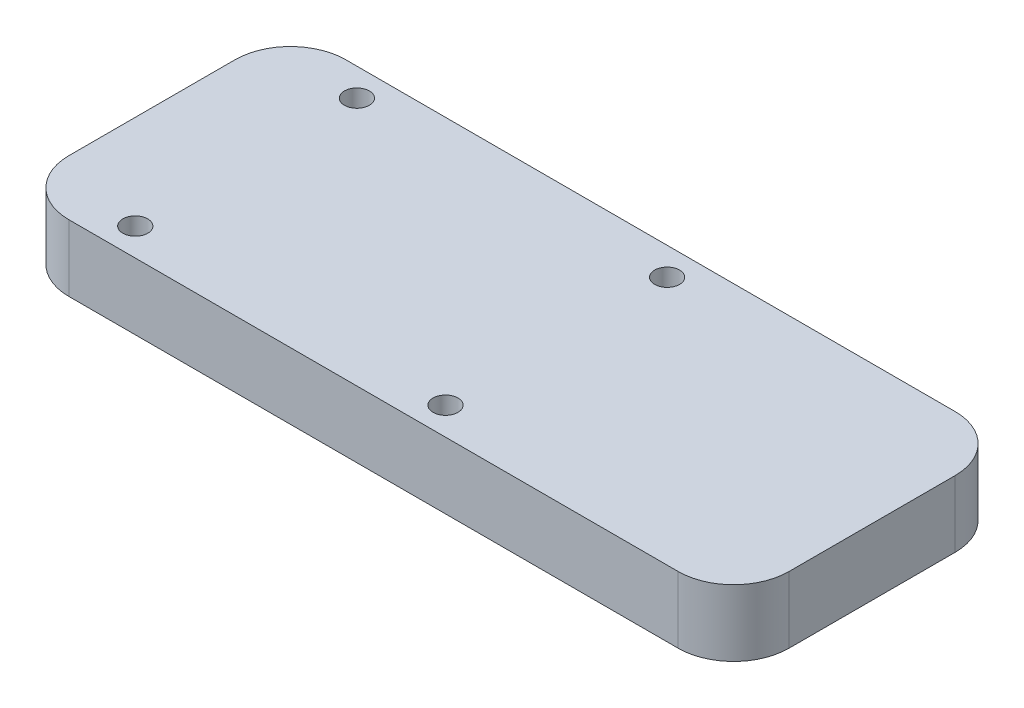
ISO-10303-21;
HEADER;
FILE_DESCRIPTION(('STEP AP214'),'2;1');
FILE_NAME('part.step','',(''),(''),'','','');
FILE_SCHEMA(('AUTOMOTIVE_DESIGN { 1 0 10303 214 1 1 1 1 }'));
ENDSEC;
DATA;
#1=APPLICATION_CONTEXT('core data for automotive mechanical design processes');
#2=APPLICATION_PROTOCOL_DEFINITION('international standard','automotive_design',2000,#1);
#3=PRODUCT_CONTEXT('',#1,'mechanical');
#4=PRODUCT('Part','Part','',(#3));
#5=PRODUCT_RELATED_PRODUCT_CATEGORY('part','',(#4));
#6=PRODUCT_DEFINITION_FORMATION('','',#4);
#7=PRODUCT_DEFINITION_CONTEXT('part definition',#1,'design');
#8=PRODUCT_DEFINITION('design','',#6,#7);
#9=PRODUCT_DEFINITION_SHAPE('','',#8);
#10=(LENGTH_UNIT() NAMED_UNIT(*) SI_UNIT(.MILLI.,.METRE.));
#11=(NAMED_UNIT(*) PLANE_ANGLE_UNIT() SI_UNIT($,.RADIAN.));
#12=(NAMED_UNIT(*) SI_UNIT($,.STERADIAN.) SOLID_ANGLE_UNIT());
#13=UNCERTAINTY_MEASURE_WITH_UNIT(LENGTH_MEASURE(1.E-05),#10,'distance_accuracy_value','');
#14=(GEOMETRIC_REPRESENTATION_CONTEXT(3) GLOBAL_UNCERTAINTY_ASSIGNED_CONTEXT((#13)) GLOBAL_UNIT_ASSIGNED_CONTEXT((#10,
#11,#12)) REPRESENTATION_CONTEXT('',''));
#15=CARTESIAN_POINT('',(0.,0.,0.));
#16=DIRECTION('',(0.,0.,1.));
#17=DIRECTION('',(1.,0.,0.));
#18=AXIS2_PLACEMENT_3D('',#15,#16,#17);
#19=CARTESIAN_POINT('',(-82.5827814569536,12.,-33.2119205298013));
#20=DIRECTION('',(0.,1.,0.));
#21=DIRECTION('',(0.,0.,1.));
#22=AXIS2_PLACEMENT_3D('',#19,#20,#21);
#23=PLANE('',#22);
#24=CARTESIAN_POINT('',(-75.5827814569536,12.,-38.2119205298013));
#25=DIRECTION('',(0.,1.,0.));
#26=DIRECTION('',(0.,0.,1.));
#27=AXIS2_PLACEMENT_3D('',#24,#25,#26);
#28=CIRCLE('',#27,2.25);
#29=CARTESIAN_POINT('',(-75.5827814569536,12.,-35.9619205298013));
#30=VERTEX_POINT('',#29);
#31=EDGE_CURVE('E191',#30,#30,#28,.T.);
#32=ORIENTED_EDGE('',*,*,#31,.F.);
#33=EDGE_LOOP('',(#32));
#34=FACE_BOUND('',#33,.T.);
#35=CARTESIAN_POINT('',(-19.5827814569536,12.,1.78807947019867));
#36=DIRECTION('',(0.,1.,0.));
#37=DIRECTION('',(0.,0.,1.));
#38=AXIS2_PLACEMENT_3D('',#35,#36,#37);
#39=CIRCLE('',#38,2.25);
#40=CARTESIAN_POINT('',(-19.5827814569536,12.,4.03807947019867));
#41=VERTEX_POINT('',#40);
#42=EDGE_CURVE('E139',#41,#41,#39,.T.);
#43=ORIENTED_EDGE('',*,*,#42,.F.);
#44=EDGE_LOOP('',(#43));
#45=FACE_BOUND('',#44,.T.);
#46=CARTESIAN_POINT('',(-82.5827814569536,12.,-33.2119205298013));
#47=DIRECTION('',(0.,1.,0.));
#48=DIRECTION('',(0.,0.,1.));
#49=AXIS2_PLACEMENT_3D('',#46,#47,#48);
#50=CIRCLE('',#49,10.);
#51=CARTESIAN_POINT('',(-82.5827814569536,12.,-43.2119205298013));
#52=VERTEX_POINT('',#51);
#53=CARTESIAN_POINT('',(-92.5827814569536,12.,-33.2119205298012));
#54=VERTEX_POINT('',#53);
#55=EDGE_CURVE('E151',#52,#54,#50,.T.);
#56=ORIENTED_EDGE('',*,*,#55,.T.);
#57=DIRECTION('',(0.,0.,1.));
#58=VECTOR('',#57,1.);
#59=CARTESIAN_POINT('',(-92.5827814569536,12.,-33.2119205298012));
#60=LINE('',#59,#58);
#61=CARTESIAN_POINT('',(-92.5827814569536,12.,-3.2119205298014));
#62=VERTEX_POINT('',#61);
#63=EDGE_CURVE('E98',#54,#62,#60,.T.);
#64=ORIENTED_EDGE('',*,*,#63,.T.);
#65=CARTESIAN_POINT('',(-82.5827814569536,12.,-3.21192052980133));
#66=DIRECTION('',(0.,1.,0.));
#67=DIRECTION('',(0.,0.,1.));
#68=AXIS2_PLACEMENT_3D('',#65,#66,#67);
#69=CIRCLE('',#68,10.);
#70=CARTESIAN_POINT('',(-82.5827814569536,12.,6.78807947019867));
#71=VERTEX_POINT('',#70);
#72=EDGE_CURVE('E168',#62,#71,#69,.T.);
#73=ORIENTED_EDGE('',*,*,#72,.T.);
#74=DIRECTION('',(1.,0.,0.));
#75=VECTOR('',#74,1.);
#76=CARTESIAN_POINT('',(-82.5827814569536,12.,6.78807947019867));
#77=LINE('',#76,#75);
#78=CARTESIAN_POINT('',(27.4172185430463,12.,6.78807947019867));
#79=VERTEX_POINT('',#78);
#80=EDGE_CURVE('E177',#71,#79,#77,.T.);
#81=ORIENTED_EDGE('',*,*,#80,.T.);
#82=CARTESIAN_POINT('',(27.4172185430464,12.,-3.21192052980133));
#83=DIRECTION('',(0.,1.,0.));
#84=DIRECTION('',(0.,0.,-1.));
#85=AXIS2_PLACEMENT_3D('',#82,#83,#84);
#86=CIRCLE('',#85,10.);
#87=CARTESIAN_POINT('',(37.4172185430464,12.,-3.21192052980141));
#88=VERTEX_POINT('',#87);
#89=EDGE_CURVE('E119',#79,#88,#86,.T.);
#90=ORIENTED_EDGE('',*,*,#89,.T.);
#91=DIRECTION('',(0.,0.,-1.));
#92=VECTOR('',#91,1.);
#93=CARTESIAN_POINT('',(37.4172185430464,12.,-3.21192052980141));
#94=LINE('',#93,#92);
#95=CARTESIAN_POINT('',(37.4172185430464,12.,-33.2119205298013));
#96=VERTEX_POINT('',#95);
#97=EDGE_CURVE('E115',#88,#96,#94,.T.);
#98=ORIENTED_EDGE('',*,*,#97,.T.);
#99=CARTESIAN_POINT('',(27.4172185430464,12.,-33.2119205298013));
#100=DIRECTION('',(0.,1.,0.));
#101=DIRECTION('',(0.,0.,1.));
#102=AXIS2_PLACEMENT_3D('',#99,#100,#101);
#103=CIRCLE('',#102,10.);
#104=CARTESIAN_POINT('',(27.4172185430463,12.,-43.2119205298013));
#105=VERTEX_POINT('',#104);
#106=EDGE_CURVE('E116',#96,#105,#103,.T.);
#107=ORIENTED_EDGE('',*,*,#106,.T.);
#108=DIRECTION('',(-1.,0.,0.));
#109=VECTOR('',#108,1.);
#110=CARTESIAN_POINT('',(27.4172185430463,12.,-43.2119205298013));
#111=LINE('',#110,#109);
#112=EDGE_CURVE('E57',#105,#52,#111,.T.);
#113=ORIENTED_EDGE('',*,*,#112,.T.);
#114=EDGE_LOOP('',(#56,#64,#73,#81,#90,#98,#107,#113));
#115=FACE_BOUND('',#114,.T.);
#116=CARTESIAN_POINT('',(-19.5827814569536,12.,-38.2119205298013));
#117=DIRECTION('',(0.,1.,0.));
#118=DIRECTION('',(0.,0.,1.));
#119=AXIS2_PLACEMENT_3D('',#116,#117,#118);
#120=CIRCLE('',#119,2.25);
#121=CARTESIAN_POINT('',(-19.5827814569536,12.,-35.9619205298013));
#122=VERTEX_POINT('',#121);
#123=EDGE_CURVE('E187',#122,#122,#120,.T.);
#124=ORIENTED_EDGE('',*,*,#123,.F.);
#125=EDGE_LOOP('',(#124));
#126=FACE_BOUND('',#125,.T.);
#127=CARTESIAN_POINT('',(-75.5827814569536,12.,1.78807947019867));
#128=DIRECTION('',(0.,1.,0.));
#129=DIRECTION('',(0.,0.,1.));
#130=AXIS2_PLACEMENT_3D('',#127,#128,#129);
#131=CIRCLE('',#130,2.25);
#132=CARTESIAN_POINT('',(-75.5827814569536,12.,4.03807947019867));
#133=VERTEX_POINT('',#132);
#134=EDGE_CURVE('E200',#133,#133,#131,.T.);
#135=ORIENTED_EDGE('',*,*,#134,.F.);
#136=EDGE_LOOP('',(#135));
#137=FACE_BOUND('',#136,.T.);
#138=ADVANCED_FACE('F39',(#34,#45,#115,#126,#137),#23,.T.);
#139=CARTESIAN_POINT('',(-82.5827814569536,0.,-33.2119205298013));
#140=DIRECTION('',(0.,1.,0.));
#141=DIRECTION('',(0.,0.,1.));
#142=AXIS2_PLACEMENT_3D('',#139,#140,#141);
#143=PLANE('',#142);
#144=CARTESIAN_POINT('',(-82.5827814569536,0.,-33.2119205298013));
#145=DIRECTION('',(0.,1.,0.));
#146=DIRECTION('',(0.,0.,1.));
#147=AXIS2_PLACEMENT_3D('',#144,#145,#146);
#148=CIRCLE('',#147,10.);
#149=CARTESIAN_POINT('',(-82.5827814569536,0.,-43.2119205298013));
#150=VERTEX_POINT('',#149);
#151=CARTESIAN_POINT('',(-92.5827814569536,0.,-33.2119205298012));
#152=VERTEX_POINT('',#151);
#153=EDGE_CURVE('E136',#150,#152,#148,.T.);
#154=ORIENTED_EDGE('',*,*,#153,.F.);
#155=DIRECTION('',(-1.,0.,0.));
#156=VECTOR('',#155,1.);
#157=CARTESIAN_POINT('',(27.4172185430463,0.,-43.2119205298013));
#158=LINE('',#157,#156);
#159=CARTESIAN_POINT('',(27.4172185430463,0.,-43.2119205298013));
#160=VERTEX_POINT('',#159);
#161=EDGE_CURVE('E91',#160,#150,#158,.T.);
#162=ORIENTED_EDGE('',*,*,#161,.F.);
#163=CARTESIAN_POINT('',(27.4172185430464,0.,-33.2119205298013));
#164=DIRECTION('',(0.,1.,0.));
#165=DIRECTION('',(0.,0.,1.));
#166=AXIS2_PLACEMENT_3D('',#163,#164,#165);
#167=CIRCLE('',#166,10.);
#168=CARTESIAN_POINT('',(37.4172185430464,0.,-33.2119205298013));
#169=VERTEX_POINT('',#168);
#170=EDGE_CURVE('E82',#169,#160,#167,.T.);
#171=ORIENTED_EDGE('',*,*,#170,.F.);
#172=DIRECTION('',(0.,0.,-1.));
#173=VECTOR('',#172,1.);
#174=CARTESIAN_POINT('',(37.4172185430464,0.,-3.21192052980141));
#175=LINE('',#174,#173);
#176=CARTESIAN_POINT('',(37.4172185430464,0.,-3.21192052980141));
#177=VERTEX_POINT('',#176);
#178=EDGE_CURVE('E128',#177,#169,#175,.T.);
#179=ORIENTED_EDGE('',*,*,#178,.F.);
#180=CARTESIAN_POINT('',(27.4172185430464,0.,-3.21192052980133));
#181=DIRECTION('',(0.,1.,0.));
#182=DIRECTION('',(0.,0.,-1.));
#183=AXIS2_PLACEMENT_3D('',#180,#181,#182);
#184=CIRCLE('',#183,10.);
#185=CARTESIAN_POINT('',(27.4172185430463,0.,6.78807947019867));
#186=VERTEX_POINT('',#185);
#187=EDGE_CURVE('E147',#186,#177,#184,.T.);
#188=ORIENTED_EDGE('',*,*,#187,.F.);
#189=DIRECTION('',(1.,0.,0.));
#190=VECTOR('',#189,1.);
#191=CARTESIAN_POINT('',(-82.5827814569536,0.,6.78807947019867));
#192=LINE('',#191,#190);
#193=CARTESIAN_POINT('',(-82.5827814569536,0.,6.78807947019867));
#194=VERTEX_POINT('',#193);
#195=EDGE_CURVE('E143',#194,#186,#192,.T.);
#196=ORIENTED_EDGE('',*,*,#195,.F.);
#197=CARTESIAN_POINT('',(-82.5827814569536,0.,-3.21192052980133));
#198=DIRECTION('',(0.,1.,0.));
#199=DIRECTION('',(0.,0.,1.));
#200=AXIS2_PLACEMENT_3D('',#197,#198,#199);
#201=CIRCLE('',#200,10.);
#202=CARTESIAN_POINT('',(-92.5827814569536,0.,-3.2119205298014));
#203=VERTEX_POINT('',#202);
#204=EDGE_CURVE('E145',#203,#194,#201,.T.);
#205=ORIENTED_EDGE('',*,*,#204,.F.);
#206=DIRECTION('',(0.,0.,1.));
#207=VECTOR('',#206,1.);
#208=CARTESIAN_POINT('',(-92.5827814569536,0.,-33.2119205298012));
#209=LINE('',#208,#207);
#210=EDGE_CURVE('E137',#152,#203,#209,.T.);
#211=ORIENTED_EDGE('',*,*,#210,.F.);
#212=EDGE_LOOP('',(#154,#162,#171,#179,#188,#196,#205,#211));
#213=FACE_BOUND('',#212,.T.);
#214=CARTESIAN_POINT('',(-19.5827814569536,0.,1.78807947019867));
#215=DIRECTION('',(0.,1.,0.));
#216=DIRECTION('',(0.,0.,1.));
#217=AXIS2_PLACEMENT_3D('',#214,#215,#216);
#218=CIRCLE('',#217,2.25);
#219=CARTESIAN_POINT('',(-19.5827814569536,0.,4.03807947019867));
#220=VERTEX_POINT('',#219);
#221=EDGE_CURVE('E184',#220,#220,#218,.T.);
#222=ORIENTED_EDGE('',*,*,#221,.T.);
#223=EDGE_LOOP('',(#222));
#224=FACE_BOUND('',#223,.T.);
#225=CARTESIAN_POINT('',(-19.5827814569536,0.,-38.2119205298013));
#226=DIRECTION('',(0.,1.,0.));
#227=DIRECTION('',(0.,0.,1.));
#228=AXIS2_PLACEMENT_3D('',#225,#226,#227);
#229=CIRCLE('',#228,2.25);
#230=CARTESIAN_POINT('',(-19.5827814569536,0.,-35.9619205298013));
#231=VERTEX_POINT('',#230);
#232=EDGE_CURVE('E192',#231,#231,#229,.T.);
#233=ORIENTED_EDGE('',*,*,#232,.T.);
#234=EDGE_LOOP('',(#233));
#235=FACE_BOUND('',#234,.T.);
#236=CARTESIAN_POINT('',(-75.5827814569536,0.,-38.2119205298013));
#237=DIRECTION('',(0.,1.,0.));
#238=DIRECTION('',(0.,0.,1.));
#239=AXIS2_PLACEMENT_3D('',#236,#237,#238);
#240=CIRCLE('',#239,2.25);
#241=CARTESIAN_POINT('',(-75.5827814569536,0.,-35.9619205298013));
#242=VERTEX_POINT('',#241);
#243=EDGE_CURVE('E197',#242,#242,#240,.T.);
#244=ORIENTED_EDGE('',*,*,#243,.T.);
#245=EDGE_LOOP('',(#244));
#246=FACE_BOUND('',#245,.T.);
#247=CARTESIAN_POINT('',(-75.5827814569536,0.,1.78807947019867));
#248=DIRECTION('',(0.,1.,0.));
#249=DIRECTION('',(0.,0.,1.));
#250=AXIS2_PLACEMENT_3D('',#247,#248,#249);
#251=CIRCLE('',#250,2.25);
#252=CARTESIAN_POINT('',(-75.5827814569536,0.,4.03807947019867));
#253=VERTEX_POINT('',#252);
#254=EDGE_CURVE('E201',#253,#253,#251,.T.);
#255=ORIENTED_EDGE('',*,*,#254,.T.);
#256=EDGE_LOOP('',(#255));
#257=FACE_BOUND('',#256,.T.);
#258=ADVANCED_FACE('F169',(#213,#224,#235,#246,#257),#143,.F.);
#259=CARTESIAN_POINT('',(-82.5827814569536,12.,-33.2119205298013));
#260=DIRECTION('',(0.,-1.,0.));
#261=DIRECTION('',(0.,0.,-1.));
#262=AXIS2_PLACEMENT_3D('',#259,#260,#261);
#263=CYLINDRICAL_SURFACE('',#262,10.);
#264=ORIENTED_EDGE('',*,*,#153,.T.);
#265=DIRECTION('',(0.,-1.,0.));
#266=VECTOR('',#265,1.);
#267=CARTESIAN_POINT('',(-92.5827814569536,12.,-33.2119205298012));
#268=LINE('',#267,#266);
#269=EDGE_CURVE('E11',#54,#152,#268,.T.);
#270=ORIENTED_EDGE('',*,*,#269,.F.);
#271=ORIENTED_EDGE('',*,*,#55,.F.);
#272=DIRECTION('',(0.,-1.,0.));
#273=VECTOR('',#272,1.);
#274=CARTESIAN_POINT('',(-82.5827814569536,12.,-43.2119205298013));
#275=LINE('',#274,#273);
#276=EDGE_CURVE('E135',#52,#150,#275,.T.);
#277=ORIENTED_EDGE('',*,*,#276,.T.);
#278=EDGE_LOOP('',(#264,#270,#271,#277));
#279=FACE_BOUND('',#278,.T.);
#280=ADVANCED_FACE('F41',(#279),#263,.T.);
#281=CARTESIAN_POINT('',(-92.5827814569536,12.,-33.2119205298012));
#282=DIRECTION('',(1.,0.,0.));
#283=DIRECTION('',(0.,0.,-1.));
#284=AXIS2_PLACEMENT_3D('',#281,#282,#283);
#285=PLANE('',#284);
#286=ORIENTED_EDGE('',*,*,#210,.T.);
#287=DIRECTION('',(0.,-1.,0.));
#288=VECTOR('',#287,1.);
#289=CARTESIAN_POINT('',(-92.5827814569536,12.,-3.2119205298014));
#290=LINE('',#289,#288);
#291=EDGE_CURVE('E48',#62,#203,#290,.T.);
#292=ORIENTED_EDGE('',*,*,#291,.F.);
#293=ORIENTED_EDGE('',*,*,#63,.F.);
#294=ORIENTED_EDGE('',*,*,#269,.T.);
#295=EDGE_LOOP('',(#286,#292,#293,#294));
#296=FACE_BOUND('',#295,.T.);
#297=ADVANCED_FACE('F240',(#296),#285,.F.);
#298=CARTESIAN_POINT('',(-82.5827814569536,12.,-3.21192052980133));
#299=DIRECTION('',(0.,-1.,0.));
#300=DIRECTION('',(0.,0.,-1.));
#301=AXIS2_PLACEMENT_3D('',#298,#299,#300);
#302=CYLINDRICAL_SURFACE('',#301,10.);
#303=ORIENTED_EDGE('',*,*,#204,.T.);
#304=DIRECTION('',(0.,-1.,0.));
#305=VECTOR('',#304,1.);
#306=CARTESIAN_POINT('',(-82.5827814569536,12.,6.78807947019867));
#307=LINE('',#306,#305);
#308=EDGE_CURVE('E156',#71,#194,#307,.T.);
#309=ORIENTED_EDGE('',*,*,#308,.F.);
#310=ORIENTED_EDGE('',*,*,#72,.F.);
#311=ORIENTED_EDGE('',*,*,#291,.T.);
#312=EDGE_LOOP('',(#303,#309,#310,#311));
#313=FACE_BOUND('',#312,.T.);
#314=ADVANCED_FACE('F163',(#313),#302,.T.);
#315=CARTESIAN_POINT('',(-82.5827814569536,12.,6.78807947019867));
#316=DIRECTION('',(0.,0.,-1.));
#317=DIRECTION('',(-1.,0.,0.));
#318=AXIS2_PLACEMENT_3D('',#315,#316,#317);
#319=PLANE('',#318);
#320=ORIENTED_EDGE('',*,*,#195,.T.);
#321=DIRECTION('',(0.,-1.,0.));
#322=VECTOR('',#321,1.);
#323=CARTESIAN_POINT('',(27.4172185430463,12.,6.78807947019867));
#324=LINE('',#323,#322);
#325=EDGE_CURVE('E155',#79,#186,#324,.T.);
#326=ORIENTED_EDGE('',*,*,#325,.F.);
#327=ORIENTED_EDGE('',*,*,#80,.F.);
#328=ORIENTED_EDGE('',*,*,#308,.T.);
#329=EDGE_LOOP('',(#320,#326,#327,#328));
#330=FACE_BOUND('',#329,.T.);
#331=ADVANCED_FACE('F172',(#330),#319,.F.);
#332=CARTESIAN_POINT('',(27.4172185430464,12.,-3.21192052980133));
#333=DIRECTION('',(0.,-1.,0.));
#334=DIRECTION('',(0.,0.,-1.));
#335=AXIS2_PLACEMENT_3D('',#332,#333,#334);
#336=CYLINDRICAL_SURFACE('',#335,10.);
#337=ORIENTED_EDGE('',*,*,#187,.T.);
#338=DIRECTION('',(0.,-1.,0.));
#339=VECTOR('',#338,1.);
#340=CARTESIAN_POINT('',(37.4172185430464,12.,-3.21192052980141));
#341=LINE('',#340,#339);
#342=EDGE_CURVE('E130',#88,#177,#341,.T.);
#343=ORIENTED_EDGE('',*,*,#342,.F.);
#344=ORIENTED_EDGE('',*,*,#89,.F.);
#345=ORIENTED_EDGE('',*,*,#325,.T.);
#346=EDGE_LOOP('',(#337,#343,#344,#345));
#347=FACE_BOUND('',#346,.T.);
#348=ADVANCED_FACE('F178',(#347),#336,.T.);
#349=CARTESIAN_POINT('',(37.4172185430464,12.,-3.21192052980141));
#350=DIRECTION('',(-1.,0.,0.));
#351=DIRECTION('',(0.,0.,1.));
#352=AXIS2_PLACEMENT_3D('',#349,#350,#351);
#353=PLANE('',#352);
#354=ORIENTED_EDGE('',*,*,#178,.T.);
#355=DIRECTION('',(0.,-1.,0.));
#356=VECTOR('',#355,1.);
#357=CARTESIAN_POINT('',(37.4172185430464,12.,-33.2119205298013));
#358=LINE('',#357,#356);
#359=EDGE_CURVE('E121',#96,#169,#358,.T.);
#360=ORIENTED_EDGE('',*,*,#359,.F.);
#361=ORIENTED_EDGE('',*,*,#97,.F.);
#362=ORIENTED_EDGE('',*,*,#342,.T.);
#363=EDGE_LOOP('',(#354,#360,#361,#362));
#364=FACE_BOUND('',#363,.T.);
#365=ADVANCED_FACE('F125',(#364),#353,.F.);
#366=CARTESIAN_POINT('',(27.4172185430464,12.,-33.2119205298013));
#367=DIRECTION('',(0.,-1.,0.));
#368=DIRECTION('',(0.,0.,-1.));
#369=AXIS2_PLACEMENT_3D('',#366,#367,#368);
#370=CYLINDRICAL_SURFACE('',#369,10.);
#371=ORIENTED_EDGE('',*,*,#170,.T.);
#372=DIRECTION('',(0.,-1.,0.));
#373=VECTOR('',#372,1.);
#374=CARTESIAN_POINT('',(27.4172185430463,12.,-43.2119205298013));
#375=LINE('',#374,#373);
#376=EDGE_CURVE('E126',#105,#160,#375,.T.);
#377=ORIENTED_EDGE('',*,*,#376,.F.);
#378=ORIENTED_EDGE('',*,*,#106,.F.);
#379=ORIENTED_EDGE('',*,*,#359,.T.);
#380=EDGE_LOOP('',(#371,#377,#378,#379));
#381=FACE_BOUND('',#380,.T.);
#382=ADVANCED_FACE('F127',(#381),#370,.T.);
#383=CARTESIAN_POINT('',(27.4172185430463,12.,-43.2119205298013));
#384=DIRECTION('',(0.,0.,1.));
#385=DIRECTION('',(1.,0.,0.));
#386=AXIS2_PLACEMENT_3D('',#383,#384,#385);
#387=PLANE('',#386);
#388=ORIENTED_EDGE('',*,*,#161,.T.);
#389=ORIENTED_EDGE('',*,*,#276,.F.);
#390=ORIENTED_EDGE('',*,*,#112,.F.);
#391=ORIENTED_EDGE('',*,*,#376,.T.);
#392=EDGE_LOOP('',(#388,#389,#390,#391));
#393=FACE_BOUND('',#392,.T.);
#394=ADVANCED_FACE('F224',(#393),#387,.F.);
#395=CARTESIAN_POINT('',(-19.5827814569536,12.,1.78807947019867));
#396=DIRECTION('',(0.,-1.,0.));
#397=DIRECTION('',(0.,0.,-1.));
#398=AXIS2_PLACEMENT_3D('',#395,#396,#397);
#399=CYLINDRICAL_SURFACE('',#398,2.25);
#400=ORIENTED_EDGE('',*,*,#42,.T.);
#401=EDGE_LOOP('',(#400));
#402=FACE_BOUND('',#401,.T.);
#403=ORIENTED_EDGE('',*,*,#221,.F.);
#404=EDGE_LOOP('',(#403));
#405=FACE_BOUND('',#404,.T.);
#406=ADVANCED_FACE('F225',(#402,#405),#399,.F.);
#407=CARTESIAN_POINT('',(-19.5827814569536,12.,-38.2119205298013));
#408=DIRECTION('',(0.,-1.,0.));
#409=DIRECTION('',(0.,0.,-1.));
#410=AXIS2_PLACEMENT_3D('',#407,#408,#409);
#411=CYLINDRICAL_SURFACE('',#410,2.25);
#412=ORIENTED_EDGE('',*,*,#123,.T.);
#413=EDGE_LOOP('',(#412));
#414=FACE_BOUND('',#413,.T.);
#415=ORIENTED_EDGE('',*,*,#232,.F.);
#416=EDGE_LOOP('',(#415));
#417=FACE_BOUND('',#416,.T.);
#418=ADVANCED_FACE('F300',(#414,#417),#411,.F.);
#419=CARTESIAN_POINT('',(-75.5827814569536,12.,-38.2119205298013));
#420=DIRECTION('',(0.,-1.,0.));
#421=DIRECTION('',(0.,0.,-1.));
#422=AXIS2_PLACEMENT_3D('',#419,#420,#421);
#423=CYLINDRICAL_SURFACE('',#422,2.25);
#424=ORIENTED_EDGE('',*,*,#31,.T.);
#425=EDGE_LOOP('',(#424));
#426=FACE_BOUND('',#425,.T.);
#427=ORIENTED_EDGE('',*,*,#243,.F.);
#428=EDGE_LOOP('',(#427));
#429=FACE_BOUND('',#428,.T.);
#430=ADVANCED_FACE('F306',(#426,#429),#423,.F.);
#431=CARTESIAN_POINT('',(-75.5827814569536,12.,1.78807947019867));
#432=DIRECTION('',(0.,-1.,0.));
#433=DIRECTION('',(0.,0.,-1.));
#434=AXIS2_PLACEMENT_3D('',#431,#432,#433);
#435=CYLINDRICAL_SURFACE('',#434,2.25);
#436=ORIENTED_EDGE('',*,*,#134,.T.);
#437=EDGE_LOOP('',(#436));
#438=FACE_BOUND('',#437,.T.);
#439=ORIENTED_EDGE('',*,*,#254,.F.);
#440=EDGE_LOOP('',(#439));
#441=FACE_BOUND('',#440,.T.);
#442=ADVANCED_FACE('F208',(#438,#441),#435,.F.);
#443=CLOSED_SHELL('',(#138,#258,#280,#297,#314,#331,#348,#365,#382,#394,#406,#418,#430,#442));
#444=MANIFOLD_SOLID_BREP('B2',#443);
#445=ADVANCED_BREP_SHAPE_REPRESENTATION('',(#18,#444),#14);
#446=SHAPE_DEFINITION_REPRESENTATION(#9,#445);
ENDSEC;
END-ISO-10303-21;
